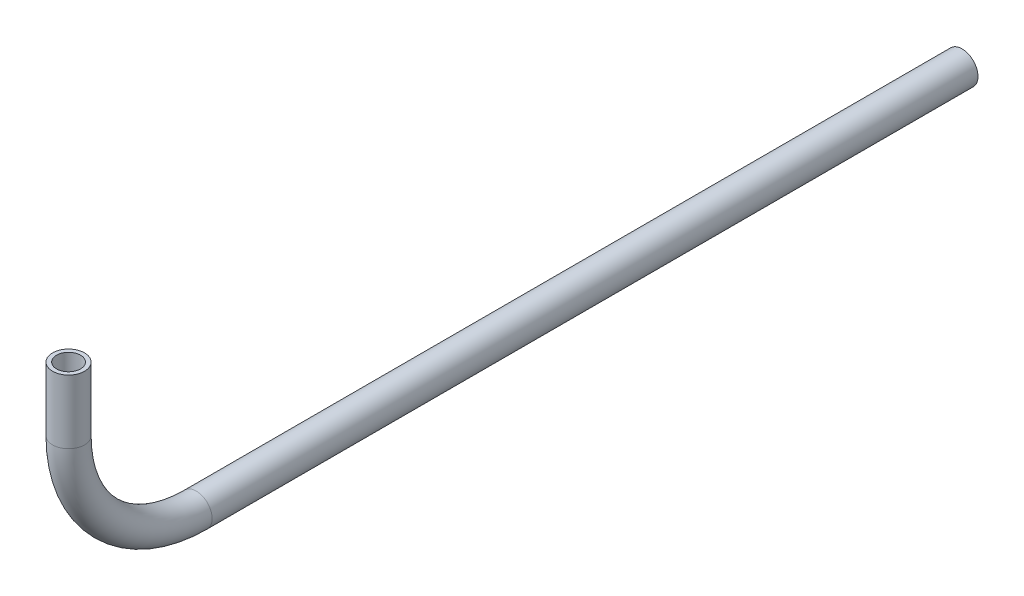
ISO-10303-21;
HEADER;
FILE_DESCRIPTION(('STEP AP214'),'2;1');
FILE_NAME('part.step','',(''),(''),'','','');
FILE_SCHEMA(('AUTOMOTIVE_DESIGN { 1 0 10303 214 1 1 1 1 }'));
ENDSEC;
DATA;
#1=APPLICATION_CONTEXT('core data for automotive mechanical design processes');
#2=APPLICATION_PROTOCOL_DEFINITION('international standard','automotive_design',2000,#1);
#3=PRODUCT_CONTEXT('',#1,'mechanical');
#4=PRODUCT('Part','Part','',(#3));
#5=PRODUCT_RELATED_PRODUCT_CATEGORY('part','',(#4));
#6=PRODUCT_DEFINITION_FORMATION('','',#4);
#7=PRODUCT_DEFINITION_CONTEXT('part definition',#1,'design');
#8=PRODUCT_DEFINITION('design','',#6,#7);
#9=PRODUCT_DEFINITION_SHAPE('','',#8);
#10=(LENGTH_UNIT() NAMED_UNIT(*) SI_UNIT(.MILLI.,.METRE.));
#11=(NAMED_UNIT(*) PLANE_ANGLE_UNIT() SI_UNIT($,.RADIAN.));
#12=(NAMED_UNIT(*) SI_UNIT($,.STERADIAN.) SOLID_ANGLE_UNIT());
#13=UNCERTAINTY_MEASURE_WITH_UNIT(LENGTH_MEASURE(1.E-05),#10,'distance_accuracy_value','');
#14=(GEOMETRIC_REPRESENTATION_CONTEXT(3) GLOBAL_UNCERTAINTY_ASSIGNED_CONTEXT((#13)) GLOBAL_UNIT_ASSIGNED_CONTEXT((#10,
#11,#12)) REPRESENTATION_CONTEXT('',''));
#15=CARTESIAN_POINT('',(0.,0.,0.));
#16=DIRECTION('',(0.,0.,1.));
#17=DIRECTION('',(1.,0.,0.));
#18=AXIS2_PLACEMENT_3D('',#15,#16,#17);
#19=CARTESIAN_POINT('',(0.,0.,0.));
#20=DIRECTION('',(0.,0.,-1.));
#21=DIRECTION('',(1.,0.,0.));
#22=AXIS2_PLACEMENT_3D('',#19,#20,#21);
#23=PLANE('',#22);
#24=CARTESIAN_POINT('',(0.,0.,0.));
#25=DIRECTION('',(0.,0.,-1.));
#26=DIRECTION('',(-1.,0.,0.));
#27=AXIS2_PLACEMENT_3D('',#24,#25,#26);
#28=CIRCLE('',#27,4.7625);
#29=CARTESIAN_POINT('',(-4.7625,0.,0.));
#30=VERTEX_POINT('',#29);
#31=EDGE_CURVE('E76',#30,#30,#28,.T.);
#32=ORIENTED_EDGE('',*,*,#31,.F.);
#33=EDGE_LOOP('',(#32));
#34=FACE_BOUND('',#33,.T.);
#35=CARTESIAN_POINT('',(0.,0.,0.));
#36=DIRECTION('',(0.,0.,-1.));
#37=DIRECTION('',(1.,0.,0.));
#38=AXIS2_PLACEMENT_3D('',#35,#36,#37);
#39=CIRCLE('',#38,6.35);
#40=CARTESIAN_POINT('',(6.35,0.,0.));
#41=VERTEX_POINT('',#40);
#42=EDGE_CURVE('E71',#41,#41,#39,.T.);
#43=ORIENTED_EDGE('',*,*,#42,.T.);
#44=EDGE_LOOP('',(#43));
#45=FACE_BOUND('',#44,.T.);
#46=ADVANCED_FACE('F57',(#34,#45),#23,.T.);
#47=CARTESIAN_POINT('',(0.,76.2,355.6));
#48=DIRECTION('',(0.,-1.,0.));
#49=DIRECTION('',(1.,0.,0.));
#50=AXIS2_PLACEMENT_3D('',#47,#48,#49);
#51=PLANE('',#50);
#52=CARTESIAN_POINT('',(0.,76.2,355.6));
#53=DIRECTION('',(0.,-1.,0.));
#54=DIRECTION('',(1.,0.,0.));
#55=AXIS2_PLACEMENT_3D('',#52,#53,#54);
#56=CIRCLE('',#55,4.7625);
#57=CARTESIAN_POINT('',(4.76250000000002,76.2,355.6));
#58=VERTEX_POINT('',#57);
#59=EDGE_CURVE('E79',#58,#58,#56,.T.);
#60=ORIENTED_EDGE('',*,*,#59,.T.);
#61=EDGE_LOOP('',(#60));
#62=FACE_BOUND('',#61,.T.);
#63=CARTESIAN_POINT('',(0.,76.2,355.6));
#64=DIRECTION('',(0.,-1.,0.));
#65=DIRECTION('',(1.,0.,0.));
#66=AXIS2_PLACEMENT_3D('',#63,#64,#65);
#67=CIRCLE('',#66,6.35);
#68=CARTESIAN_POINT('',(6.35000000000002,76.2,355.6));
#69=VERTEX_POINT('',#68);
#70=EDGE_CURVE('E11',#69,#69,#67,.T.);
#71=ORIENTED_EDGE('',*,*,#70,.F.);
#72=EDGE_LOOP('',(#71));
#73=FACE_BOUND('',#72,.T.);
#74=ADVANCED_FACE('F89',(#62,#73),#51,.F.);
#75=CARTESIAN_POINT('',(0.,0.,0.));
#76=DIRECTION('',(0.,0.,1.));
#77=DIRECTION('',(1.,0.,0.));
#78=AXIS2_PLACEMENT_3D('',#75,#76,#77);
#79=CYLINDRICAL_SURFACE('',#78,6.35);
#80=CARTESIAN_POINT('',(0.,0.,304.8));
#81=DIRECTION('',(0.,0.,-1.));
#82=DIRECTION('',(1.,0.,0.));
#83=AXIS2_PLACEMENT_3D('',#80,#81,#82);
#84=CIRCLE('',#83,6.35);
#85=CARTESIAN_POINT('',(0.,-6.35,304.8));
#86=VERTEX_POINT('',#85);
#87=EDGE_CURVE('E67',#86,#86,#84,.T.);
#88=ORIENTED_EDGE('',*,*,#87,.T.);
#89=EDGE_LOOP('',(#88));
#90=FACE_BOUND('',#89,.T.);
#91=ORIENTED_EDGE('',*,*,#42,.F.);
#92=EDGE_LOOP('',(#91));
#93=FACE_BOUND('',#92,.T.);
#94=ADVANCED_FACE('F115',(#90,#93),#79,.T.);
#95=CARTESIAN_POINT('',(0.,50.8,304.8));
#96=DIRECTION('',(-1.,0.,0.));
#97=DIRECTION('',(0.,0.,1.));
#98=AXIS2_PLACEMENT_3D('',#95,#96,#97);
#99=TOROIDAL_SURFACE('',#98,50.8,6.35);
#100=CARTESIAN_POINT('',(0.,50.8,355.6));
#101=DIRECTION('',(0.,-1.,0.));
#102=DIRECTION('',(1.,0.,0.));
#103=AXIS2_PLACEMENT_3D('',#100,#101,#102);
#104=CIRCLE('',#103,6.35);
#105=CARTESIAN_POINT('',(0.,50.8,361.95));
#106=VERTEX_POINT('',#105);
#107=EDGE_CURVE('E63',#106,#106,#104,.T.);
#108=CARTESIAN_POINT('',(0.,50.8,304.8));
#109=DIRECTION('',(-1.,0.,0.));
#110=DIRECTION('',(0.,0.,1.));
#111=AXIS2_PLACEMENT_3D('',#108,#109,#110);
#112=CIRCLE('',#111,57.15);
#113=EDGE_CURVE('',#86,#106,#112,.T.);
#114=ORIENTED_EDGE('',*,*,#87,.F.);
#115=ORIENTED_EDGE('',*,*,#107,.T.);
#116=ORIENTED_EDGE('',*,*,#113,.T.);
#117=ORIENTED_EDGE('',*,*,#113,.F.);
#118=EDGE_LOOP('',(#114,#116,#115,#117));
#119=FACE_BOUND('',#118,.T.);
#120=ADVANCED_FACE('F117',(#119),#99,.T.);
#121=CARTESIAN_POINT('',(0.,50.8,355.6));
#122=DIRECTION('',(0.,1.,0.));
#123=DIRECTION('',(-1.,0.,0.));
#124=AXIS2_PLACEMENT_3D('',#121,#122,#123);
#125=CYLINDRICAL_SURFACE('',#124,6.35);
#126=ORIENTED_EDGE('',*,*,#70,.T.);
#127=EDGE_LOOP('',(#126));
#128=FACE_BOUND('',#127,.T.);
#129=ORIENTED_EDGE('',*,*,#107,.F.);
#130=EDGE_LOOP('',(#129));
#131=FACE_BOUND('',#130,.T.);
#132=ADVANCED_FACE('F107',(#128,#131),#125,.T.);
#133=CARTESIAN_POINT('',(0.,0.,-3.048));
#134=DIRECTION('',(0.,0.,1.));
#135=DIRECTION('',(1.,0.,0.));
#136=AXIS2_PLACEMENT_3D('',#133,#134,#135);
#137=CYLINDRICAL_SURFACE('',#136,4.7625);
#138=CARTESIAN_POINT('',(0.,0.,304.8));
#139=DIRECTION('',(0.,0.,-1.));
#140=DIRECTION('',(1.,0.,0.));
#141=AXIS2_PLACEMENT_3D('',#138,#139,#140);
#142=CIRCLE('',#141,4.7625);
#143=CARTESIAN_POINT('',(0.,-4.76250000000006,304.8));
#144=VERTEX_POINT('',#143);
#145=EDGE_CURVE('E80',#144,#144,#142,.T.);
#146=ORIENTED_EDGE('',*,*,#145,.F.);
#147=EDGE_LOOP('',(#146));
#148=FACE_BOUND('',#147,.T.);
#149=ORIENTED_EDGE('',*,*,#31,.T.);
#150=EDGE_LOOP('',(#149));
#151=FACE_BOUND('',#150,.T.);
#152=ADVANCED_FACE('F97',(#148,#151),#137,.F.);
#153=CARTESIAN_POINT('',(0.,50.8,304.8));
#154=DIRECTION('',(-1.,0.,0.));
#155=DIRECTION('',(0.,0.,1.));
#156=AXIS2_PLACEMENT_3D('',#153,#154,#155);
#157=TOROIDAL_SURFACE('',#156,50.8000000000001,4.7625);
#158=CARTESIAN_POINT('',(0.,50.8000000000023,355.6));
#159=DIRECTION('',(0.,-1.,0.));
#160=DIRECTION('',(1.,0.,0.));
#161=AXIS2_PLACEMENT_3D('',#158,#159,#160);
#162=CIRCLE('',#161,4.7625);
#163=CARTESIAN_POINT('',(0.,50.8000000000026,360.3625));
#164=VERTEX_POINT('',#163);
#165=EDGE_CURVE('E83',#164,#164,#162,.T.);
#166=CARTESIAN_POINT('',(0.,50.8,304.8));
#167=DIRECTION('',(-1.,0.,0.));
#168=DIRECTION('',(0.,0.,1.));
#169=AXIS2_PLACEMENT_3D('',#166,#167,#168);
#170=CIRCLE('',#169,55.5625000000001);
#171=EDGE_CURVE('',#144,#164,#170,.T.);
#172=ORIENTED_EDGE('',*,*,#145,.T.);
#173=ORIENTED_EDGE('',*,*,#165,.F.);
#174=ORIENTED_EDGE('',*,*,#171,.T.);
#175=ORIENTED_EDGE('',*,*,#171,.F.);
#176=EDGE_LOOP('',(#172,#174,#173,#175));
#177=FACE_BOUND('',#176,.T.);
#178=ADVANCED_FACE('F95',(#177),#157,.F.);
#179=CARTESIAN_POINT('',(0.,50.8000000000024,355.6));
#180=DIRECTION('',(0.,1.,0.));
#181=DIRECTION('',(-1.,0.,0.));
#182=AXIS2_PLACEMENT_3D('',#179,#180,#181);
#183=CYLINDRICAL_SURFACE('',#182,4.7625);
#184=ORIENTED_EDGE('',*,*,#59,.F.);
#185=EDGE_LOOP('',(#184));
#186=FACE_BOUND('',#185,.T.);
#187=ORIENTED_EDGE('',*,*,#165,.T.);
#188=EDGE_LOOP('',(#187));
#189=FACE_BOUND('',#188,.T.);
#190=ADVANCED_FACE('F92',(#186,#189),#183,.F.);
#191=CLOSED_SHELL('',(#46,#74,#94,#120,#132,#152,#178,#190));
#192=MANIFOLD_SOLID_BREP('B2',#191);
#193=ADVANCED_BREP_SHAPE_REPRESENTATION('',(#18,#192),#14);
#194=SHAPE_DEFINITION_REPRESENTATION(#9,#193);
ENDSEC;
END-ISO-10303-21;
